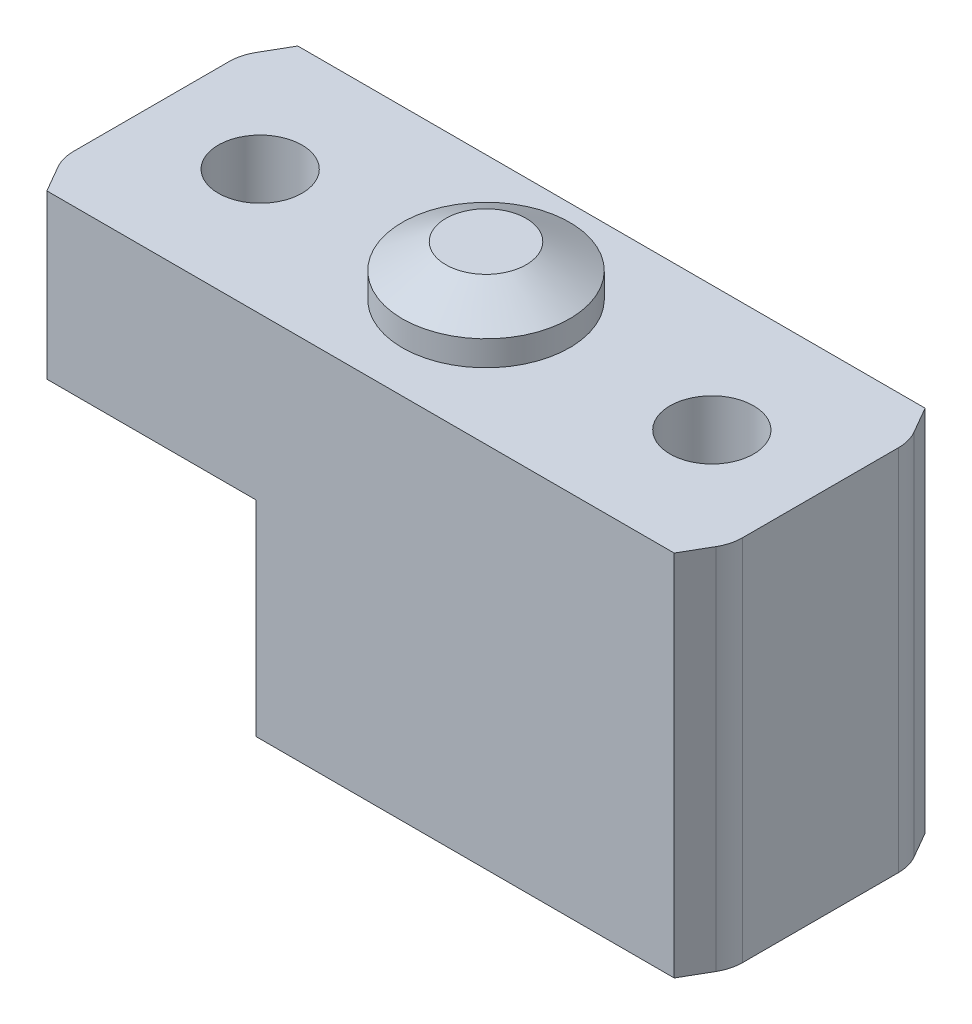
ISO-10303-21;
HEADER;
FILE_DESCRIPTION(('STEP AP214'),'2;1');
FILE_NAME('part.step','',(''),(''),'','','');
FILE_SCHEMA(('AUTOMOTIVE_DESIGN { 1 0 10303 214 1 1 1 1 }'));
ENDSEC;
DATA;
#1=APPLICATION_CONTEXT('core data for automotive mechanical design processes');
#2=APPLICATION_PROTOCOL_DEFINITION('international standard','automotive_design',2000,#1);
#3=PRODUCT_CONTEXT('',#1,'mechanical');
#4=PRODUCT('Part','Part','',(#3));
#5=PRODUCT_RELATED_PRODUCT_CATEGORY('part','',(#4));
#6=PRODUCT_DEFINITION_FORMATION('','',#4);
#7=PRODUCT_DEFINITION_CONTEXT('part definition',#1,'design');
#8=PRODUCT_DEFINITION('design','',#6,#7);
#9=PRODUCT_DEFINITION_SHAPE('','',#8);
#10=(LENGTH_UNIT() NAMED_UNIT(*) SI_UNIT(.MILLI.,.METRE.));
#11=(NAMED_UNIT(*) PLANE_ANGLE_UNIT() SI_UNIT($,.RADIAN.));
#12=(NAMED_UNIT(*) SI_UNIT($,.STERADIAN.) SOLID_ANGLE_UNIT());
#13=UNCERTAINTY_MEASURE_WITH_UNIT(LENGTH_MEASURE(1.E-05),#10,'distance_accuracy_value','');
#14=(GEOMETRIC_REPRESENTATION_CONTEXT(3) GLOBAL_UNCERTAINTY_ASSIGNED_CONTEXT((#13)) GLOBAL_UNIT_ASSIGNED_CONTEXT((#10,
#11,#12)) REPRESENTATION_CONTEXT('',''));
#15=CARTESIAN_POINT('',(0.,0.,0.));
#16=DIRECTION('',(0.,0.,1.));
#17=DIRECTION('',(1.,0.,0.));
#18=AXIS2_PLACEMENT_3D('',#15,#16,#17);
#19=CARTESIAN_POINT('',(0.,0.,0.));
#20=DIRECTION('',(0.,1.,0.));
#21=DIRECTION('',(0.,0.,1.));
#22=AXIS2_PLACEMENT_3D('',#19,#20,#21);
#23=PLANE('',#22);
#24=CARTESIAN_POINT('',(1.3,0.,1.5));
#25=DIRECTION('',(0.,1.,0.));
#26=DIRECTION('',(0.,0.,1.));
#27=AXIS2_PLACEMENT_3D('',#24,#25,#26);
#28=CIRCLE('',#27,0.5);
#29=CARTESIAN_POINT('',(1.3,0.,2.));
#30=VERTEX_POINT('',#29);
#31=EDGE_CURVE('E454',#30,#30,#28,.T.);
#32=ORIENTED_EDGE('',*,*,#31,.T.);
#33=EDGE_LOOP('',(#32));
#34=FACE_BOUND('',#33,.T.);
#35=DIRECTION('',(0.,0.,-1.));
#36=VECTOR('',#35,1.);
#37=CARTESIAN_POINT('',(2.5,0.,3.));
#38=LINE('',#37,#36);
#39=CARTESIAN_POINT('',(2.5,0.,2.43301270189222));
#40=VERTEX_POINT('',#39);
#41=CARTESIAN_POINT('',(2.5,0.,0.566987298107781));
#42=VERTEX_POINT('',#41);
#43=EDGE_CURVE('E437',#40,#42,#38,.T.);
#44=ORIENTED_EDGE('',*,*,#43,.F.);
#45=DIRECTION('',(1.,0.,0.));
#46=VECTOR('',#45,1.);
#47=CARTESIAN_POINT('',(0.,0.,2.43301270189222));
#48=LINE('',#47,#46);
#49=CARTESIAN_POINT('',(0.,0.,2.43301270189222));
#50=VERTEX_POINT('',#49);
#51=EDGE_CURVE('E252',#40,#50,#48,.F.);
#52=ORIENTED_EDGE('',*,*,#51,.T.);
#53=DIRECTION('',(0.,0.,1.));
#54=VECTOR('',#53,1.);
#55=CARTESIAN_POINT('',(0.,0.,0.));
#56=LINE('',#55,#54);
#57=CARTESIAN_POINT('',(0.,0.,0.566987298107781));
#58=VERTEX_POINT('',#57);
#59=EDGE_CURVE('E461',#58,#50,#56,.T.);
#60=ORIENTED_EDGE('',*,*,#59,.F.);
#61=DIRECTION('',(-1.,0.,0.));
#62=VECTOR('',#61,1.);
#63=CARTESIAN_POINT('',(2.5,0.,0.566987298107781));
#64=LINE('',#63,#62);
#65=EDGE_CURVE('E248',#58,#42,#64,.F.);
#66=ORIENTED_EDGE('',*,*,#65,.T.);
#67=EDGE_LOOP('',(#44,#52,#60,#66));
#68=FACE_BOUND('',#67,.T.);
#69=ADVANCED_FACE('F41',(#34,#68),#23,.F.);
#70=CARTESIAN_POINT('',(0.,2.2,0.));
#71=DIRECTION('',(1.,0.,0.));
#72=DIRECTION('',(0.,0.,-1.));
#73=AXIS2_PLACEMENT_3D('',#70,#71,#72);
#74=PLANE('',#73);
#75=ORIENTED_EDGE('',*,*,#59,.T.);
#76=DIRECTION('',(0.,-1.,0.));
#77=VECTOR('',#76,1.);
#78=CARTESIAN_POINT('',(0.,2.2,2.43301270189222));
#79=LINE('',#78,#77);
#80=CARTESIAN_POINT('',(0.,2.2,2.43301270189222));
#81=VERTEX_POINT('',#80);
#82=EDGE_CURVE('E259',#50,#81,#79,.F.);
#83=ORIENTED_EDGE('',*,*,#82,.T.);
#84=DIRECTION('',(0.,0.,1.));
#85=VECTOR('',#84,1.);
#86=CARTESIAN_POINT('',(0.,2.2,0.));
#87=LINE('',#86,#85);
#88=CARTESIAN_POINT('',(0.,2.2,0.566987298107781));
#89=VERTEX_POINT('',#88);
#90=EDGE_CURVE('E456',#89,#81,#87,.T.);
#91=ORIENTED_EDGE('',*,*,#90,.F.);
#92=DIRECTION('',(0.,1.,0.));
#93=VECTOR('',#92,1.);
#94=CARTESIAN_POINT('',(0.,0.,0.566987298107781));
#95=LINE('',#94,#93);
#96=EDGE_CURVE('E253',#89,#58,#95,.F.);
#97=ORIENTED_EDGE('',*,*,#96,.T.);
#98=EDGE_LOOP('',(#75,#83,#91,#97));
#99=FACE_BOUND('',#98,.T.);
#100=ADVANCED_FACE('F312',(#99),#74,.F.);
#101=CARTESIAN_POINT('',(0.,2.2,3.));
#102=DIRECTION('',(0.,0.,-1.));
#103=DIRECTION('',(-1.,0.,0.));
#104=AXIS2_PLACEMENT_3D('',#101,#102,#103);
#105=PLANE('',#104);
#106=DIRECTION('',(1.,0.,0.));
#107=VECTOR('',#106,1.);
#108=CARTESIAN_POINT('',(0.,2.2,3.));
#109=LINE('',#108,#107);
#110=CARTESIAN_POINT('',(0.250000000000002,2.2,3.));
#111=VERTEX_POINT('',#110);
#112=CARTESIAN_POINT('',(7.75,2.2,3.));
#113=VERTEX_POINT('',#112);
#114=EDGE_CURVE('E465',#111,#113,#109,.T.);
#115=ORIENTED_EDGE('',*,*,#114,.F.);
#116=DIRECTION('',(0.,-1.,0.));
#117=VECTOR('',#116,1.);
#118=CARTESIAN_POINT('',(0.250000000000002,2.2,3.));
#119=LINE('',#118,#117);
#120=CARTESIAN_POINT('',(0.250000000000002,0.250000000000002,3.));
#121=VERTEX_POINT('',#120);
#122=EDGE_CURVE('E225',#111,#121,#119,.T.);
#123=ORIENTED_EDGE('',*,*,#122,.T.);
#124=DIRECTION('',(1.,0.,0.));
#125=VECTOR('',#124,1.);
#126=CARTESIAN_POINT('',(0.,0.250000000000002,3.));
#127=LINE('',#126,#125);
#128=CARTESIAN_POINT('',(2.75,0.250000000000002,3.));
#129=VERTEX_POINT('',#128);
#130=EDGE_CURVE('E216',#121,#129,#127,.T.);
#131=ORIENTED_EDGE('',*,*,#130,.T.);
#132=DIRECTION('',(0.,-1.,0.));
#133=VECTOR('',#132,1.);
#134=CARTESIAN_POINT('',(2.75,2.2,3.));
#135=LINE('',#134,#133);
#136=CARTESIAN_POINT('',(2.75,-2.2,3.));
#137=VERTEX_POINT('',#136);
#138=EDGE_CURVE('E217',#129,#137,#135,.T.);
#139=ORIENTED_EDGE('',*,*,#138,.T.);
#140=DIRECTION('',(-1.,0.,0.));
#141=VECTOR('',#140,1.);
#142=CARTESIAN_POINT('',(8.,-2.2,3.));
#143=LINE('',#142,#141);
#144=CARTESIAN_POINT('',(7.75,-2.2,3.));
#145=VERTEX_POINT('',#144);
#146=EDGE_CURVE('E438',#145,#137,#143,.T.);
#147=ORIENTED_EDGE('',*,*,#146,.F.);
#148=DIRECTION('',(0.,1.,0.));
#149=VECTOR('',#148,1.);
#150=CARTESIAN_POINT('',(7.75,2.2,3.));
#151=LINE('',#150,#149);
#152=EDGE_CURVE('E218',#145,#113,#151,.T.);
#153=ORIENTED_EDGE('',*,*,#152,.T.);
#154=EDGE_LOOP('',(#115,#123,#131,#139,#147,#153));
#155=FACE_BOUND('',#154,.T.);
#156=ADVANCED_FACE('F318',(#155),#105,.F.);
#157=CARTESIAN_POINT('',(8.,2.2,0.));
#158=DIRECTION('',(-1.,0.,0.));
#159=DIRECTION('',(0.,0.,1.));
#160=AXIS2_PLACEMENT_3D('',#157,#158,#159);
#161=PLANE('',#160);
#162=DIRECTION('',(0.,0.,-1.));
#163=VECTOR('',#162,1.);
#164=CARTESIAN_POINT('',(8.,2.2,0.));
#165=LINE('',#164,#163);
#166=CARTESIAN_POINT('',(8.,2.2,2.43301270189222));
#167=VERTEX_POINT('',#166);
#168=CARTESIAN_POINT('',(8.,2.2,0.566987298107782));
#169=VERTEX_POINT('',#168);
#170=EDGE_CURVE('E470',#167,#169,#165,.T.);
#171=ORIENTED_EDGE('',*,*,#170,.F.);
#172=DIRECTION('',(0.,1.,0.));
#173=VECTOR('',#172,1.);
#174=CARTESIAN_POINT('',(8.,-2.2,2.43301270189222));
#175=LINE('',#174,#173);
#176=CARTESIAN_POINT('',(8.,-2.2,2.43301270189222));
#177=VERTEX_POINT('',#176);
#178=EDGE_CURVE('E277',#167,#177,#175,.F.);
#179=ORIENTED_EDGE('',*,*,#178,.T.);
#180=DIRECTION('',(0.,0.,1.));
#181=VECTOR('',#180,1.);
#182=CARTESIAN_POINT('',(8.,-2.2,3.));
#183=LINE('',#182,#181);
#184=CARTESIAN_POINT('',(8.,-2.2,0.566987298107782));
#185=VERTEX_POINT('',#184);
#186=EDGE_CURVE('E432',#185,#177,#183,.T.);
#187=ORIENTED_EDGE('',*,*,#186,.F.);
#188=DIRECTION('',(0.,-1.,0.));
#189=VECTOR('',#188,1.);
#190=CARTESIAN_POINT('',(8.,2.2,0.566987298107782));
#191=LINE('',#190,#189);
#192=EDGE_CURVE('E274',#185,#169,#191,.F.);
#193=ORIENTED_EDGE('',*,*,#192,.T.);
#194=EDGE_LOOP('',(#171,#179,#187,#193));
#195=FACE_BOUND('',#194,.T.);
#196=ADVANCED_FACE('F326',(#195),#161,.F.);
#197=CARTESIAN_POINT('',(0.,2.2,0.));
#198=DIRECTION('',(0.,0.,1.));
#199=DIRECTION('',(1.,0.,0.));
#200=AXIS2_PLACEMENT_3D('',#197,#198,#199);
#201=PLANE('',#200);
#202=DIRECTION('',(-1.,0.,0.));
#203=VECTOR('',#202,1.);
#204=CARTESIAN_POINT('',(0.,2.2,0.));
#205=LINE('',#204,#203);
#206=CARTESIAN_POINT('',(7.75,2.2,0.));
#207=VERTEX_POINT('',#206);
#208=CARTESIAN_POINT('',(0.25,2.2,0.));
#209=VERTEX_POINT('',#208);
#210=EDGE_CURVE('E460',#207,#209,#205,.T.);
#211=ORIENTED_EDGE('',*,*,#210,.F.);
#212=DIRECTION('',(0.,-1.,0.));
#213=VECTOR('',#212,1.);
#214=CARTESIAN_POINT('',(7.75,2.2,0.));
#215=LINE('',#214,#213);
#216=CARTESIAN_POINT('',(7.75,-2.2,0.));
#217=VERTEX_POINT('',#216);
#218=EDGE_CURVE('E189',#207,#217,#215,.T.);
#219=ORIENTED_EDGE('',*,*,#218,.T.);
#220=DIRECTION('',(1.,0.,0.));
#221=VECTOR('',#220,1.);
#222=CARTESIAN_POINT('',(8.,-2.2,0.));
#223=LINE('',#222,#221);
#224=CARTESIAN_POINT('',(2.75,-2.2,0.));
#225=VERTEX_POINT('',#224);
#226=EDGE_CURVE('E175',#225,#217,#223,.T.);
#227=ORIENTED_EDGE('',*,*,#226,.F.);
#228=DIRECTION('',(0.,1.,0.));
#229=VECTOR('',#228,1.);
#230=CARTESIAN_POINT('',(2.75,2.2,0.));
#231=LINE('',#230,#229);
#232=CARTESIAN_POINT('',(2.75,0.25,0.));
#233=VERTEX_POINT('',#232);
#234=EDGE_CURVE('E187',#225,#233,#231,.T.);
#235=ORIENTED_EDGE('',*,*,#234,.T.);
#236=DIRECTION('',(-1.,0.,0.));
#237=VECTOR('',#236,1.);
#238=CARTESIAN_POINT('',(0.,0.25,0.));
#239=LINE('',#238,#237);
#240=CARTESIAN_POINT('',(0.25,0.25,0.));
#241=VERTEX_POINT('',#240);
#242=EDGE_CURVE('E195',#233,#241,#239,.T.);
#243=ORIENTED_EDGE('',*,*,#242,.T.);
#244=DIRECTION('',(0.,1.,0.));
#245=VECTOR('',#244,1.);
#246=CARTESIAN_POINT('',(0.25,2.2,0.));
#247=LINE('',#246,#245);
#248=EDGE_CURVE('E200',#241,#209,#247,.T.);
#249=ORIENTED_EDGE('',*,*,#248,.T.);
#250=EDGE_LOOP('',(#211,#219,#227,#235,#243,#249));
#251=FACE_BOUND('',#250,.T.);
#252=ADVANCED_FACE('F183',(#251),#201,.F.);
#253=CARTESIAN_POINT('',(0.,2.2,0.));
#254=DIRECTION('',(0.,1.,0.));
#255=DIRECTION('',(0.,0.,1.));
#256=AXIS2_PLACEMENT_3D('',#253,#254,#255);
#257=PLANE('',#256);
#258=CARTESIAN_POINT('',(1.3,2.2,1.5));
#259=DIRECTION('',(0.,1.,0.));
#260=DIRECTION('',(0.,0.,1.));
#261=AXIS2_PLACEMENT_3D('',#258,#259,#260);
#262=CIRCLE('',#261,0.5);
#263=CARTESIAN_POINT('',(1.3,2.2,2.));
#264=VERTEX_POINT('',#263);
#265=EDGE_CURVE('E448',#264,#264,#262,.T.);
#266=ORIENTED_EDGE('',*,*,#265,.F.);
#267=EDGE_LOOP('',(#266));
#268=FACE_BOUND('',#267,.T.);
#269=CARTESIAN_POINT('',(6.7,2.2,1.5));
#270=DIRECTION('',(0.,1.,0.));
#271=DIRECTION('',(0.,0.,-1.));
#272=AXIS2_PLACEMENT_3D('',#269,#270,#271);
#273=CIRCLE('',#272,0.5);
#274=CARTESIAN_POINT('',(6.7,2.2,1.));
#275=VERTEX_POINT('',#274);
#276=EDGE_CURVE('E186',#275,#275,#273,.T.);
#277=ORIENTED_EDGE('',*,*,#276,.F.);
#278=EDGE_LOOP('',(#277));
#279=FACE_BOUND('',#278,.T.);
#280=CARTESIAN_POINT('',(4.,2.2,1.5));
#281=DIRECTION('',(0.,1.,0.));
#282=DIRECTION('',(0.,0.,1.));
#283=AXIS2_PLACEMENT_3D('',#280,#281,#282);
#284=CIRCLE('',#283,1.);
#285=CARTESIAN_POINT('',(4.,2.2,2.5));
#286=VERTEX_POINT('',#285);
#287=EDGE_CURVE('E458',#286,#286,#284,.T.);
#288=ORIENTED_EDGE('',*,*,#287,.F.);
#289=EDGE_LOOP('',(#288));
#290=FACE_BOUND('',#289,.T.);
#291=ORIENTED_EDGE('',*,*,#90,.T.);
#292=CARTESIAN_POINT('',(0.5,2.2,2.43301270189222));
#293=DIRECTION('',(0.,1.,0.));
#294=DIRECTION('',(0.,0.,1.));
#295=AXIS2_PLACEMENT_3D('',#292,#293,#294);
#296=CIRCLE('',#295,0.5);
#297=CARTESIAN_POINT('',(0.066987298107781,2.2,2.68301270189222));
#298=VERTEX_POINT('',#297);
#299=EDGE_CURVE('E267',#81,#298,#296,.T.);
#300=ORIENTED_EDGE('',*,*,#299,.T.);
#301=DIRECTION('',(-0.5,0.,-0.866025403784439));
#302=VECTOR('',#301,1.);
#303=CARTESIAN_POINT('',(-1.11153810567666,2.2,0.641746824526943));
#304=LINE('',#303,#302);
#305=EDGE_CURVE('E209',#298,#111,#304,.F.);
#306=ORIENTED_EDGE('',*,*,#305,.T.);
#307=ORIENTED_EDGE('',*,*,#114,.T.);
#308=DIRECTION('',(-0.5,0.,0.866025403784439));
#309=VECTOR('',#308,1.);
#310=CARTESIAN_POINT('',(7.11153810567666,2.2,4.1058484396647));
#311=LINE('',#310,#309);
#312=CARTESIAN_POINT('',(7.93301270189222,2.2,2.68301270189222));
#313=VERTEX_POINT('',#312);
#314=EDGE_CURVE('E207',#113,#313,#311,.F.);
#315=ORIENTED_EDGE('',*,*,#314,.T.);
#316=CARTESIAN_POINT('',(7.5,2.2,2.43301270189222));
#317=DIRECTION('',(0.,1.,0.));
#318=DIRECTION('',(0.,0.,1.));
#319=AXIS2_PLACEMENT_3D('',#316,#317,#318);
#320=CIRCLE('',#319,0.5);
#321=EDGE_CURVE('E264',#313,#167,#320,.T.);
#322=ORIENTED_EDGE('',*,*,#321,.T.);
#323=ORIENTED_EDGE('',*,*,#170,.T.);
#324=CARTESIAN_POINT('',(7.5,2.2,0.566987298107782));
#325=DIRECTION('',(0.,1.,0.));
#326=DIRECTION('',(0.,0.,1.));
#327=AXIS2_PLACEMENT_3D('',#324,#325,#326);
#328=CIRCLE('',#327,0.5);
#329=CARTESIAN_POINT('',(7.93301270189222,2.2,0.316987298107784));
#330=VERTEX_POINT('',#329);
#331=EDGE_CURVE('E260',#169,#330,#328,.T.);
#332=ORIENTED_EDGE('',*,*,#331,.T.);
#333=DIRECTION('',(0.5,0.,0.866025403784439));
#334=VECTOR('',#333,1.);
#335=CARTESIAN_POINT('',(5.8125,2.2,-3.3558484396647));
#336=LINE('',#335,#334);
#337=EDGE_CURVE('E213',#330,#207,#336,.F.);
#338=ORIENTED_EDGE('',*,*,#337,.T.);
#339=ORIENTED_EDGE('',*,*,#210,.T.);
#340=DIRECTION('',(0.5,0.,-0.866025403784439));
#341=VECTOR('',#340,1.);
#342=CARTESIAN_POINT('',(0.1875,2.2,0.108253175473055));
#343=LINE('',#342,#341);
#344=CARTESIAN_POINT('',(0.0669872981077807,2.2,0.316987298107781));
#345=VERTEX_POINT('',#344);
#346=EDGE_CURVE('E211',#209,#345,#343,.F.);
#347=ORIENTED_EDGE('',*,*,#346,.T.);
#348=CARTESIAN_POINT('',(0.5,2.2,0.566987298107781));
#349=DIRECTION('',(0.,1.,0.));
#350=DIRECTION('',(0.,0.,1.));
#351=AXIS2_PLACEMENT_3D('',#348,#349,#350);
#352=CIRCLE('',#351,0.5);
#353=EDGE_CURVE('E265',#345,#89,#352,.T.);
#354=ORIENTED_EDGE('',*,*,#353,.T.);
#355=EDGE_LOOP('',(#291,#300,#306,#307,#315,#322,#323,#332,#338,#339,#347,#354));
#356=FACE_BOUND('',#355,.T.);
#357=ADVANCED_FACE('F329',(#268,#279,#290,#356),#257,.T.);
#358=CARTESIAN_POINT('',(4.,2.8,1.5));
#359=DIRECTION('',(0.,-1.,0.));
#360=DIRECTION('',(0.,0.,-1.));
#361=AXIS2_PLACEMENT_3D('',#358,#359,#360);
#362=CYLINDRICAL_SURFACE('',#361,1.);
#363=CARTESIAN_POINT('',(4.,2.5,1.5));
#364=DIRECTION('',(0.,1.,0.));
#365=DIRECTION('',(0.,0.,1.));
#366=AXIS2_PLACEMENT_3D('',#363,#364,#365);
#367=CIRCLE('',#366,1.);
#368=CARTESIAN_POINT('',(4.,2.5,2.5));
#369=VERTEX_POINT('',#368);
#370=EDGE_CURVE('E11',#369,#369,#367,.F.);
#371=ORIENTED_EDGE('',*,*,#370,.T.);
#372=EDGE_LOOP('',(#371));
#373=FACE_BOUND('',#372,.T.);
#374=ORIENTED_EDGE('',*,*,#287,.T.);
#375=EDGE_LOOP('',(#374));
#376=FACE_BOUND('',#375,.T.);
#377=ADVANCED_FACE('F505',(#373,#376),#362,.T.);
#378=CARTESIAN_POINT('',(4.,2.8,1.5));
#379=DIRECTION('',(0.,1.,0.));
#380=DIRECTION('',(0.,0.,1.));
#381=AXIS2_PLACEMENT_3D('',#378,#379,#380);
#382=PLANE('',#381);
#383=CARTESIAN_POINT('',(4.,2.8,1.5));
#384=DIRECTION('',(0.,1.,0.));
#385=DIRECTION('',(0.,0.,1.));
#386=AXIS2_PLACEMENT_3D('',#383,#384,#385);
#387=CIRCLE('',#386,0.480384757729335);
#388=CARTESIAN_POINT('',(4.,2.8,1.98038475772933));
#389=VERTEX_POINT('',#388);
#390=EDGE_CURVE('E49',#389,#389,#387,.T.);
#391=ORIENTED_EDGE('',*,*,#390,.T.);
#392=EDGE_LOOP('',(#391));
#393=FACE_BOUND('',#392,.T.);
#394=ADVANCED_FACE('F301',(#393),#382,.T.);
#395=CARTESIAN_POINT('',(6.7,-0.3,1.5));
#396=DIRECTION('',(0.,1.,0.));
#397=DIRECTION('',(0.,0.,1.));
#398=AXIS2_PLACEMENT_3D('',#395,#396,#397);
#399=CYLINDRICAL_SURFACE('',#398,0.5);
#400=CARTESIAN_POINT('',(6.7,-2.2,1.5));
#401=DIRECTION('',(0.,-1.,0.));
#402=DIRECTION('',(0.,0.,-1.));
#403=AXIS2_PLACEMENT_3D('',#400,#401,#402);
#404=CIRCLE('',#403,0.5);
#405=CARTESIAN_POINT('',(6.7,-2.2,1.));
#406=VERTEX_POINT('',#405);
#407=EDGE_CURVE('E233',#406,#406,#404,.T.);
#408=ORIENTED_EDGE('',*,*,#407,.T.);
#409=EDGE_LOOP('',(#408));
#410=FACE_BOUND('',#409,.T.);
#411=ORIENTED_EDGE('',*,*,#276,.T.);
#412=EDGE_LOOP('',(#411));
#413=FACE_BOUND('',#412,.T.);
#414=ADVANCED_FACE('F493',(#410,#413),#399,.F.);
#415=CARTESIAN_POINT('',(1.3,-0.3,1.5));
#416=DIRECTION('',(0.,1.,0.));
#417=DIRECTION('',(0.,0.,1.));
#418=AXIS2_PLACEMENT_3D('',#415,#416,#417);
#419=CYLINDRICAL_SURFACE('',#418,0.5);
#420=ORIENTED_EDGE('',*,*,#265,.T.);
#421=EDGE_LOOP('',(#420));
#422=FACE_BOUND('',#421,.T.);
#423=ORIENTED_EDGE('',*,*,#31,.F.);
#424=EDGE_LOOP('',(#423));
#425=FACE_BOUND('',#424,.T.);
#426=ADVANCED_FACE('F482',(#422,#425),#419,.F.);
#427=CARTESIAN_POINT('',(0.,-2.2,0.));
#428=DIRECTION('',(0.,1.,0.));
#429=DIRECTION('',(0.,0.,1.));
#430=AXIS2_PLACEMENT_3D('',#427,#428,#429);
#431=PLANE('',#430);
#432=ORIENTED_EDGE('',*,*,#407,.F.);
#433=EDGE_LOOP('',(#432));
#434=FACE_BOUND('',#433,.T.);
#435=CARTESIAN_POINT('',(4.,-2.2,1.5));
#436=DIRECTION('',(0.,-1.,0.));
#437=DIRECTION('',(0.,0.,-1.));
#438=AXIS2_PLACEMENT_3D('',#435,#436,#437);
#439=CIRCLE('',#438,1.);
#440=CARTESIAN_POINT('',(4.,-2.2,0.5));
#441=VERTEX_POINT('',#440);
#442=EDGE_CURVE('E447',#441,#441,#439,.T.);
#443=ORIENTED_EDGE('',*,*,#442,.F.);
#444=EDGE_LOOP('',(#443));
#445=FACE_BOUND('',#444,.T.);
#446=DIRECTION('',(0.5,0.,0.866025403784439));
#447=VECTOR('',#446,1.);
#448=CARTESIAN_POINT('',(2.5,-2.2,2.56698729810778));
#449=LINE('',#448,#447);
#450=CARTESIAN_POINT('',(2.56698729810778,-2.2,2.68301270189222));
#451=VERTEX_POINT('',#450);
#452=EDGE_CURVE('E178',#137,#451,#449,.F.);
#453=ORIENTED_EDGE('',*,*,#452,.T.);
#454=CARTESIAN_POINT('',(3.,-2.2,2.43301270189222));
#455=DIRECTION('',(0.,1.,0.));
#456=DIRECTION('',(0.,0.,1.));
#457=AXIS2_PLACEMENT_3D('',#454,#455,#456);
#458=CIRCLE('',#457,0.5);
#459=CARTESIAN_POINT('',(2.5,-2.2,2.43301270189222));
#460=VERTEX_POINT('',#459);
#461=EDGE_CURVE('E250',#451,#460,#458,.F.);
#462=ORIENTED_EDGE('',*,*,#461,.T.);
#463=DIRECTION('',(0.,0.,-1.));
#464=VECTOR('',#463,1.);
#465=CARTESIAN_POINT('',(2.5,-2.2,3.));
#466=LINE('',#465,#464);
#467=CARTESIAN_POINT('',(2.5,-2.2,0.566987298107781));
#468=VERTEX_POINT('',#467);
#469=EDGE_CURVE('E188',#460,#468,#466,.T.);
#470=ORIENTED_EDGE('',*,*,#469,.T.);
#471=CARTESIAN_POINT('',(3.,-2.2,0.566987298107781));
#472=DIRECTION('',(0.,1.,0.));
#473=DIRECTION('',(0.,0.,1.));
#474=AXIS2_PLACEMENT_3D('',#471,#472,#473);
#475=CIRCLE('',#474,0.5);
#476=CARTESIAN_POINT('',(2.56698729810778,-2.2,0.316987298107781));
#477=VERTEX_POINT('',#476);
#478=EDGE_CURVE('E174',#468,#477,#475,.F.);
#479=ORIENTED_EDGE('',*,*,#478,.T.);
#480=DIRECTION('',(-0.5,0.,0.866025403784439));
#481=VECTOR('',#480,1.);
#482=CARTESIAN_POINT('',(2.75,-2.2,0.));
#483=LINE('',#482,#481);
#484=EDGE_CURVE('E170',#477,#225,#483,.F.);
#485=ORIENTED_EDGE('',*,*,#484,.T.);
#486=ORIENTED_EDGE('',*,*,#226,.T.);
#487=DIRECTION('',(-0.5,0.,-0.866025403784439));
#488=VECTOR('',#487,1.);
#489=CARTESIAN_POINT('',(7.75,-2.2,0.));
#490=LINE('',#489,#488);
#491=CARTESIAN_POINT('',(7.93301270189222,-2.2,0.316987298107783));
#492=VERTEX_POINT('',#491);
#493=EDGE_CURVE('E180',#217,#492,#490,.F.);
#494=ORIENTED_EDGE('',*,*,#493,.T.);
#495=CARTESIAN_POINT('',(7.5,-2.2,0.566987298107782));
#496=DIRECTION('',(0.,1.,0.));
#497=DIRECTION('',(0.,0.,1.));
#498=AXIS2_PLACEMENT_3D('',#495,#496,#497);
#499=CIRCLE('',#498,0.5);
#500=EDGE_CURVE('E245',#492,#185,#499,.F.);
#501=ORIENTED_EDGE('',*,*,#500,.T.);
#502=ORIENTED_EDGE('',*,*,#186,.T.);
#503=CARTESIAN_POINT('',(7.5,-2.2,2.43301270189222));
#504=DIRECTION('',(0.,1.,0.));
#505=DIRECTION('',(0.,0.,1.));
#506=AXIS2_PLACEMENT_3D('',#503,#504,#505);
#507=CIRCLE('',#506,0.5);
#508=CARTESIAN_POINT('',(7.93301270189222,-2.2,2.68301270189222));
#509=VERTEX_POINT('',#508);
#510=EDGE_CURVE('E242',#177,#509,#507,.F.);
#511=ORIENTED_EDGE('',*,*,#510,.T.);
#512=DIRECTION('',(0.5,0.,-0.866025403784439));
#513=VECTOR('',#512,1.);
#514=CARTESIAN_POINT('',(8.,-2.2,2.56698729810778));
#515=LINE('',#514,#513);
#516=EDGE_CURVE('E199',#509,#145,#515,.F.);
#517=ORIENTED_EDGE('',*,*,#516,.T.);
#518=ORIENTED_EDGE('',*,*,#146,.T.);
#519=EDGE_LOOP('',(#453,#462,#470,#479,#485,#486,#494,#501,#502,#511,#517,#518));
#520=FACE_BOUND('',#519,.T.);
#521=ADVANCED_FACE('F167',(#434,#445,#520),#431,.F.);
#522=CARTESIAN_POINT('',(2.5,-2.2,3.));
#523=DIRECTION('',(1.,0.,0.));
#524=DIRECTION('',(0.,0.,-1.));
#525=AXIS2_PLACEMENT_3D('',#522,#523,#524);
#526=PLANE('',#525);
#527=ORIENTED_EDGE('',*,*,#469,.F.);
#528=DIRECTION('',(0.,-1.,0.));
#529=VECTOR('',#528,1.);
#530=CARTESIAN_POINT('',(2.5,0.,2.43301270189222));
#531=LINE('',#530,#529);
#532=EDGE_CURVE('E240',#460,#40,#531,.F.);
#533=ORIENTED_EDGE('',*,*,#532,.T.);
#534=ORIENTED_EDGE('',*,*,#43,.T.);
#535=DIRECTION('',(0.,1.,0.));
#536=VECTOR('',#535,1.);
#537=CARTESIAN_POINT('',(2.5,-2.2,0.566987298107781));
#538=LINE('',#537,#536);
#539=EDGE_CURVE('E228',#42,#468,#538,.F.);
#540=ORIENTED_EDGE('',*,*,#539,.T.);
#541=EDGE_LOOP('',(#527,#533,#534,#540));
#542=FACE_BOUND('',#541,.T.);
#543=ADVANCED_FACE('F476',(#542),#526,.F.);
#544=CARTESIAN_POINT('',(4.,-2.8,1.5));
#545=DIRECTION('',(0.,1.,0.));
#546=DIRECTION('',(0.,0.,1.));
#547=AXIS2_PLACEMENT_3D('',#544,#545,#546);
#548=CYLINDRICAL_SURFACE('',#547,1.);
#549=CARTESIAN_POINT('',(4.,-2.5,1.5));
#550=DIRECTION('',(0.,-1.,0.));
#551=DIRECTION('',(0.,0.,-1.));
#552=AXIS2_PLACEMENT_3D('',#549,#550,#551);
#553=CIRCLE('',#552,1.);
#554=CARTESIAN_POINT('',(4.,-2.5,0.5));
#555=VERTEX_POINT('',#554);
#556=EDGE_CURVE('E298',#555,#555,#553,.F.);
#557=ORIENTED_EDGE('',*,*,#556,.T.);
#558=EDGE_LOOP('',(#557));
#559=FACE_BOUND('',#558,.T.);
#560=ORIENTED_EDGE('',*,*,#442,.T.);
#561=EDGE_LOOP('',(#560));
#562=FACE_BOUND('',#561,.T.);
#563=ADVANCED_FACE('F479',(#559,#562),#548,.T.);
#564=CARTESIAN_POINT('',(4.,-2.8,1.5));
#565=DIRECTION('',(0.,-1.,0.));
#566=DIRECTION('',(0.,0.,-1.));
#567=AXIS2_PLACEMENT_3D('',#564,#565,#566);
#568=PLANE('',#567);
#569=CARTESIAN_POINT('',(4.,-2.8,1.5));
#570=DIRECTION('',(0.,-1.,0.));
#571=DIRECTION('',(0.,0.,-1.));
#572=AXIS2_PLACEMENT_3D('',#569,#570,#571);
#573=CIRCLE('',#572,0.480384757729339);
#574=CARTESIAN_POINT('',(4.,-2.8,1.01961524227066));
#575=VERTEX_POINT('',#574);
#576=EDGE_CURVE('E285',#575,#575,#573,.T.);
#577=ORIENTED_EDGE('',*,*,#576,.T.);
#578=EDGE_LOOP('',(#577));
#579=FACE_BOUND('',#578,.T.);
#580=ADVANCED_FACE('F345',(#579),#568,.T.);
#581=CARTESIAN_POINT('',(7.75,2.2,0.));
#582=DIRECTION('',(-0.866025403784439,0.,0.5));
#583=DIRECTION('',(0.,-1.,0.));
#584=AXIS2_PLACEMENT_3D('',#581,#582,#583);
#585=PLANE('',#584);
#586=ORIENTED_EDGE('',*,*,#337,.F.);
#587=DIRECTION('',(0.,1.,0.));
#588=VECTOR('',#587,1.);
#589=CARTESIAN_POINT('',(7.93301270189222,-2.2,0.316987298107782));
#590=LINE('',#589,#588);
#591=EDGE_CURVE('E284',#330,#492,#590,.F.);
#592=ORIENTED_EDGE('',*,*,#591,.T.);
#593=ORIENTED_EDGE('',*,*,#493,.F.);
#594=ORIENTED_EDGE('',*,*,#218,.F.);
#595=EDGE_LOOP('',(#586,#592,#593,#594));
#596=FACE_BOUND('',#595,.T.);
#597=ADVANCED_FACE('F336',(#596),#585,.F.);
#598=CARTESIAN_POINT('',(0.,2.2,0.43301270189222));
#599=DIRECTION('',(0.866025403784439,0.,0.5));
#600=DIRECTION('',(0.,-1.,0.));
#601=AXIS2_PLACEMENT_3D('',#598,#599,#600);
#602=PLANE('',#601);
#603=DIRECTION('',(-0.447213595499958,-0.447213595499958,0.774596669241483));
#604=VECTOR('',#603,1.);
#605=CARTESIAN_POINT('',(0.44,0.44,-0.329089653438087));
#606=LINE('',#605,#604);
#607=CARTESIAN_POINT('',(0.0669872981077808,0.0669872981077807,0.316987298107781));
#608=VERTEX_POINT('',#607);
#609=EDGE_CURVE('E226',#608,#241,#606,.F.);
#610=ORIENTED_EDGE('',*,*,#609,.F.);
#611=DIRECTION('',(0.,-1.,0.));
#612=VECTOR('',#611,1.);
#613=CARTESIAN_POINT('',(0.0669872981077808,2.2,0.316987298107781));
#614=LINE('',#613,#612);
#615=EDGE_CURVE('E268',#608,#345,#614,.F.);
#616=ORIENTED_EDGE('',*,*,#615,.T.);
#617=ORIENTED_EDGE('',*,*,#346,.F.);
#618=ORIENTED_EDGE('',*,*,#248,.F.);
#619=EDGE_LOOP('',(#610,#616,#617,#618));
#620=FACE_BOUND('',#619,.T.);
#621=ADVANCED_FACE('F343',(#620),#602,.F.);
#622=CARTESIAN_POINT('',(0.,0.25,0.));
#623=DIRECTION('',(0.,0.866025403784439,0.5));
#624=DIRECTION('',(-1.,0.,0.));
#625=AXIS2_PLACEMENT_3D('',#622,#623,#624);
#626=PLANE('',#625);
#627=DIRECTION('',(-0.447213595499958,-0.447213595499958,0.774596669241483));
#628=VECTOR('',#627,1.);
#629=CARTESIAN_POINT('',(3.14,0.640000000000001,-0.675499814951862));
#630=LINE('',#629,#628);
#631=CARTESIAN_POINT('',(2.56698729810778,0.066987298107781,0.316987298107781));
#632=VERTEX_POINT('',#631);
#633=EDGE_CURVE('E194',#632,#233,#630,.F.);
#634=ORIENTED_EDGE('',*,*,#633,.F.);
#635=DIRECTION('',(1.,0.,0.));
#636=VECTOR('',#635,1.);
#637=CARTESIAN_POINT('',(0.,0.0669872981077808,0.316987298107781));
#638=LINE('',#637,#636);
#639=EDGE_CURVE('E63',#632,#608,#638,.F.);
#640=ORIENTED_EDGE('',*,*,#639,.T.);
#641=ORIENTED_EDGE('',*,*,#609,.T.);
#642=ORIENTED_EDGE('',*,*,#242,.F.);
#643=EDGE_LOOP('',(#634,#640,#641,#642));
#644=FACE_BOUND('',#643,.T.);
#645=ADVANCED_FACE('F353',(#644),#626,.F.);
#646=CARTESIAN_POINT('',(2.75,2.2,0.));
#647=DIRECTION('',(0.866025403784439,0.,0.5));
#648=DIRECTION('',(0.,1.,0.));
#649=AXIS2_PLACEMENT_3D('',#646,#647,#648);
#650=PLANE('',#649);
#651=ORIENTED_EDGE('',*,*,#484,.F.);
#652=DIRECTION('',(0.,-1.,0.));
#653=VECTOR('',#652,1.);
#654=CARTESIAN_POINT('',(2.56698729810778,0.,0.316987298107781));
#655=LINE('',#654,#653);
#656=EDGE_CURVE('E60',#477,#632,#655,.F.);
#657=ORIENTED_EDGE('',*,*,#656,.T.);
#658=ORIENTED_EDGE('',*,*,#633,.T.);
#659=ORIENTED_EDGE('',*,*,#234,.F.);
#660=EDGE_LOOP('',(#651,#657,#658,#659));
#661=FACE_BOUND('',#660,.T.);
#662=ADVANCED_FACE('F192',(#661),#650,.F.);
#663=CARTESIAN_POINT('',(2.5,-2.2,2.56698729810778));
#664=DIRECTION('',(0.866025403784439,0.,-0.5));
#665=DIRECTION('',(0.,1.,0.));
#666=AXIS2_PLACEMENT_3D('',#663,#664,#665);
#667=PLANE('',#666);
#668=DIRECTION('',(-0.447213595499958,-0.447213595499958,-0.774596669241484));
#669=VECTOR('',#668,1.);
#670=CARTESIAN_POINT('',(2.2,-0.299999999999998,2.04737205583712));
#671=LINE('',#670,#669);
#672=CARTESIAN_POINT('',(2.56698729810778,0.0669872981077805,2.68301270189222));
#673=VERTEX_POINT('',#672);
#674=EDGE_CURVE('E230',#673,#129,#671,.F.);
#675=ORIENTED_EDGE('',*,*,#674,.F.);
#676=DIRECTION('',(0.,1.,0.));
#677=VECTOR('',#676,1.);
#678=CARTESIAN_POINT('',(2.56698729810778,-2.2,2.68301270189222));
#679=LINE('',#678,#677);
#680=EDGE_CURVE('E239',#673,#451,#679,.F.);
#681=ORIENTED_EDGE('',*,*,#680,.T.);
#682=ORIENTED_EDGE('',*,*,#452,.F.);
#683=ORIENTED_EDGE('',*,*,#138,.F.);
#684=EDGE_LOOP('',(#675,#681,#682,#683));
#685=FACE_BOUND('',#684,.T.);
#686=ADVANCED_FACE('F351',(#685),#667,.F.);
#687=CARTESIAN_POINT('',(0.,0.250000000000002,3.));
#688=DIRECTION('',(0.,0.866025403784439,-0.5));
#689=DIRECTION('',(1.,0.,0.));
#690=AXIS2_PLACEMENT_3D('',#687,#688,#689);
#691=PLANE('',#690);
#692=DIRECTION('',(-0.447213595499958,-0.447213595499958,-0.774596669241484));
#693=VECTOR('',#692,1.);
#694=CARTESIAN_POINT('',(0.200000000000002,0.200000000000002,2.91339745962156));
#695=LINE('',#694,#693);
#696=CARTESIAN_POINT('',(0.066987298107781,0.0669872981077806,2.68301270189222));
#697=VERTEX_POINT('',#696);
#698=EDGE_CURVE('E235',#697,#121,#695,.F.);
#699=ORIENTED_EDGE('',*,*,#698,.F.);
#700=DIRECTION('',(-1.,0.,0.));
#701=VECTOR('',#700,1.);
#702=CARTESIAN_POINT('',(2.5,0.0669872981077806,2.68301270189222));
#703=LINE('',#702,#701);
#704=EDGE_CURVE('E254',#697,#673,#703,.F.);
#705=ORIENTED_EDGE('',*,*,#704,.T.);
#706=ORIENTED_EDGE('',*,*,#674,.T.);
#707=ORIENTED_EDGE('',*,*,#130,.F.);
#708=EDGE_LOOP('',(#699,#705,#706,#707));
#709=FACE_BOUND('',#708,.T.);
#710=ADVANCED_FACE('F372',(#709),#691,.F.);
#711=CARTESIAN_POINT('',(0.250000000000002,2.2,3.));
#712=DIRECTION('',(0.866025403784439,0.,-0.5));
#713=DIRECTION('',(0.,-1.,0.));
#714=AXIS2_PLACEMENT_3D('',#711,#712,#713);
#715=PLANE('',#714);
#716=ORIENTED_EDGE('',*,*,#305,.F.);
#717=DIRECTION('',(0.,1.,0.));
#718=VECTOR('',#717,1.);
#719=CARTESIAN_POINT('',(0.066987298107781,0.,2.68301270189222));
#720=LINE('',#719,#718);
#721=EDGE_CURVE('E270',#298,#697,#720,.F.);
#722=ORIENTED_EDGE('',*,*,#721,.T.);
#723=ORIENTED_EDGE('',*,*,#698,.T.);
#724=ORIENTED_EDGE('',*,*,#122,.F.);
#725=EDGE_LOOP('',(#716,#722,#723,#724));
#726=FACE_BOUND('',#725,.T.);
#727=ADVANCED_FACE('F366',(#726),#715,.F.);
#728=CARTESIAN_POINT('',(8.,2.2,2.56698729810778));
#729=DIRECTION('',(-0.866025403784439,0.,-0.5));
#730=DIRECTION('',(0.,-1.,0.));
#731=AXIS2_PLACEMENT_3D('',#728,#729,#730);
#732=PLANE('',#731);
#733=ORIENTED_EDGE('',*,*,#516,.F.);
#734=DIRECTION('',(0.,-1.,0.));
#735=VECTOR('',#734,1.);
#736=CARTESIAN_POINT('',(7.93301270189222,2.2,2.68301270189222));
#737=LINE('',#736,#735);
#738=EDGE_CURVE('E280',#509,#313,#737,.F.);
#739=ORIENTED_EDGE('',*,*,#738,.T.);
#740=ORIENTED_EDGE('',*,*,#314,.F.);
#741=ORIENTED_EDGE('',*,*,#152,.F.);
#742=EDGE_LOOP('',(#733,#739,#740,#741));
#743=FACE_BOUND('',#742,.T.);
#744=ADVANCED_FACE('F373',(#743),#732,.F.);
#745=CARTESIAN_POINT('',(0.5,2.2,2.43301270189222));
#746=DIRECTION('',(0.,1.,0.));
#747=DIRECTION('',(0.,0.,1.));
#748=AXIS2_PLACEMENT_3D('',#745,#746,#747);
#749=CYLINDRICAL_SURFACE('',#748,0.5);
#750=ORIENTED_EDGE('',*,*,#299,.F.);
#751=ORIENTED_EDGE('',*,*,#82,.F.);
#752=CARTESIAN_POINT('',(0.5,0.5,2.43301270189222));
#753=DIRECTION('',(-0.707106781186547,0.707106781186547,0.));
#754=DIRECTION('',(0.707106781186547,0.707106781186547,0.));
#755=AXIS2_PLACEMENT_3D('',#752,#753,#754);
#756=ELLIPSE('',#755,0.707106781186547,0.5);
#757=EDGE_CURVE('E234',#697,#50,#756,.F.);
#758=ORIENTED_EDGE('',*,*,#757,.F.);
#759=ORIENTED_EDGE('',*,*,#721,.F.);
#760=EDGE_LOOP('',(#750,#751,#758,#759));
#761=FACE_BOUND('',#760,.T.);
#762=ADVANCED_FACE('F393',(#761),#749,.T.);
#763=CARTESIAN_POINT('',(0.,0.5,2.43301270189222));
#764=DIRECTION('',(-1.,0.,0.));
#765=DIRECTION('',(0.,0.,1.));
#766=AXIS2_PLACEMENT_3D('',#763,#764,#765);
#767=CYLINDRICAL_SURFACE('',#766,0.5);
#768=ORIENTED_EDGE('',*,*,#757,.T.);
#769=ORIENTED_EDGE('',*,*,#51,.F.);
#770=CARTESIAN_POINT('',(3.,0.5,2.43301270189222));
#771=DIRECTION('',(-0.707106781186547,0.707106781186547,0.));
#772=DIRECTION('',(0.707106781186547,0.707106781186547,0.));
#773=AXIS2_PLACEMENT_3D('',#770,#771,#772);
#774=ELLIPSE('',#773,0.707106781186547,0.5);
#775=EDGE_CURVE('E281',#673,#40,#774,.F.);
#776=ORIENTED_EDGE('',*,*,#775,.F.);
#777=ORIENTED_EDGE('',*,*,#704,.F.);
#778=EDGE_LOOP('',(#768,#769,#776,#777));
#779=FACE_BOUND('',#778,.T.);
#780=ADVANCED_FACE('F399',(#779),#767,.T.);
#781=CARTESIAN_POINT('',(3.,-2.2,2.43301270189222));
#782=DIRECTION('',(0.,1.,0.));
#783=DIRECTION('',(0.,0.,1.));
#784=AXIS2_PLACEMENT_3D('',#781,#782,#783);
#785=CYLINDRICAL_SURFACE('',#784,0.5);
#786=ORIENTED_EDGE('',*,*,#461,.F.);
#787=ORIENTED_EDGE('',*,*,#680,.F.);
#788=ORIENTED_EDGE('',*,*,#775,.T.);
#789=ORIENTED_EDGE('',*,*,#532,.F.);
#790=EDGE_LOOP('',(#786,#787,#788,#789));
#791=FACE_BOUND('',#790,.T.);
#792=ADVANCED_FACE('F392',(#791),#785,.T.);
#793=CARTESIAN_POINT('',(3.,-2.2,0.566987298107781));
#794=DIRECTION('',(0.,-1.,0.));
#795=DIRECTION('',(0.,0.,-1.));
#796=AXIS2_PLACEMENT_3D('',#793,#794,#795);
#797=CYLINDRICAL_SURFACE('',#796,0.5);
#798=ORIENTED_EDGE('',*,*,#478,.F.);
#799=ORIENTED_EDGE('',*,*,#539,.F.);
#800=CARTESIAN_POINT('',(3.,0.5,0.566987298107781));
#801=DIRECTION('',(0.707106781186547,-0.707106781186547,0.));
#802=DIRECTION('',(0.707106781186547,0.707106781186547,0.));
#803=AXIS2_PLACEMENT_3D('',#800,#801,#802);
#804=ELLIPSE('',#803,0.707106781186547,0.5);
#805=EDGE_CURVE('E289',#632,#42,#804,.F.);
#806=ORIENTED_EDGE('',*,*,#805,.F.);
#807=ORIENTED_EDGE('',*,*,#656,.F.);
#808=EDGE_LOOP('',(#798,#799,#806,#807));
#809=FACE_BOUND('',#808,.T.);
#810=ADVANCED_FACE('F397',(#809),#797,.T.);
#811=CARTESIAN_POINT('',(0.,0.5,0.566987298107781));
#812=DIRECTION('',(1.,0.,0.));
#813=DIRECTION('',(0.,0.,-1.));
#814=AXIS2_PLACEMENT_3D('',#811,#812,#813);
#815=CYLINDRICAL_SURFACE('',#814,0.5);
#816=ORIENTED_EDGE('',*,*,#805,.T.);
#817=ORIENTED_EDGE('',*,*,#65,.F.);
#818=CARTESIAN_POINT('',(0.5,0.5,0.566987298107781));
#819=DIRECTION('',(0.707106781186547,-0.707106781186547,0.));
#820=DIRECTION('',(0.707106781186547,0.707106781186547,0.));
#821=AXIS2_PLACEMENT_3D('',#818,#819,#820);
#822=ELLIPSE('',#821,0.707106781186547,0.5);
#823=EDGE_CURVE('E288',#608,#58,#822,.F.);
#824=ORIENTED_EDGE('',*,*,#823,.F.);
#825=ORIENTED_EDGE('',*,*,#639,.F.);
#826=EDGE_LOOP('',(#816,#817,#824,#825));
#827=FACE_BOUND('',#826,.T.);
#828=ADVANCED_FACE('F408',(#827),#815,.T.);
#829=CARTESIAN_POINT('',(0.5,2.2,0.566987298107781));
#830=DIRECTION('',(0.,-1.,0.));
#831=DIRECTION('',(0.,0.,-1.));
#832=AXIS2_PLACEMENT_3D('',#829,#830,#831);
#833=CYLINDRICAL_SURFACE('',#832,0.5);
#834=ORIENTED_EDGE('',*,*,#353,.F.);
#835=ORIENTED_EDGE('',*,*,#615,.F.);
#836=ORIENTED_EDGE('',*,*,#823,.T.);
#837=ORIENTED_EDGE('',*,*,#96,.F.);
#838=EDGE_LOOP('',(#834,#835,#836,#837));
#839=FACE_BOUND('',#838,.T.);
#840=ADVANCED_FACE('F403',(#839),#833,.T.);
#841=CARTESIAN_POINT('',(7.5,2.2,2.43301270189222));
#842=DIRECTION('',(0.,-1.,0.));
#843=DIRECTION('',(0.,0.,-1.));
#844=AXIS2_PLACEMENT_3D('',#841,#842,#843);
#845=CYLINDRICAL_SURFACE('',#844,0.5);
#846=ORIENTED_EDGE('',*,*,#321,.F.);
#847=ORIENTED_EDGE('',*,*,#738,.F.);
#848=ORIENTED_EDGE('',*,*,#510,.F.);
#849=ORIENTED_EDGE('',*,*,#178,.F.);
#850=EDGE_LOOP('',(#846,#847,#848,#849));
#851=FACE_BOUND('',#850,.T.);
#852=ADVANCED_FACE('F409',(#851),#845,.T.);
#853=CARTESIAN_POINT('',(7.5,2.2,0.566987298107782));
#854=DIRECTION('',(0.,1.,0.));
#855=DIRECTION('',(0.,0.,1.));
#856=AXIS2_PLACEMENT_3D('',#853,#854,#855);
#857=CYLINDRICAL_SURFACE('',#856,0.5);
#858=ORIENTED_EDGE('',*,*,#500,.F.);
#859=ORIENTED_EDGE('',*,*,#591,.F.);
#860=ORIENTED_EDGE('',*,*,#331,.F.);
#861=ORIENTED_EDGE('',*,*,#192,.F.);
#862=EDGE_LOOP('',(#858,#859,#860,#861));
#863=FACE_BOUND('',#862,.T.);
#864=ADVANCED_FACE('F307',(#863),#857,.T.);
#865=CARTESIAN_POINT('',(4.,-2.8,1.5));
#866=DIRECTION('',(0.,1.,0.));
#867=DIRECTION('',(0.,0.,1.));
#868=AXIS2_PLACEMENT_3D('',#865,#866,#867);
#869=CONICAL_SURFACE('',#868,0.480384757729339,1.0471975511966);
#870=ORIENTED_EDGE('',*,*,#556,.F.);
#871=EDGE_LOOP('',(#870));
#872=FACE_BOUND('',#871,.T.);
#873=ORIENTED_EDGE('',*,*,#576,.F.);
#874=EDGE_LOOP('',(#873));
#875=FACE_BOUND('',#874,.T.);
#876=ADVANCED_FACE('F302',(#872,#875),#869,.T.);
#877=CARTESIAN_POINT('',(4.,2.8,1.5));
#878=DIRECTION('',(0.,-1.,0.));
#879=DIRECTION('',(0.,0.,-1.));
#880=AXIS2_PLACEMENT_3D('',#877,#878,#879);
#881=CONICAL_SURFACE('',#880,0.480384757729335,1.0471975511966);
#882=ORIENTED_EDGE('',*,*,#370,.F.);
#883=EDGE_LOOP('',(#882));
#884=FACE_BOUND('',#883,.T.);
#885=ORIENTED_EDGE('',*,*,#390,.F.);
#886=EDGE_LOOP('',(#885));
#887=FACE_BOUND('',#886,.T.);
#888=ADVANCED_FACE('F42',(#884,#887),#881,.T.);
#889=CLOSED_SHELL('',(#69,#100,#156,#196,#252,#357,#377,#394,#414,#426,#521,#543,#563,#580,#597,
#621,#645,#662,#686,#710,#727,#744,#762,#780,#792,#810,#828,#840,#852,#864,#876,#888));
#890=MANIFOLD_SOLID_BREP('B2',#889);
#891=ADVANCED_BREP_SHAPE_REPRESENTATION('',(#18,#890),#14);
#892=SHAPE_DEFINITION_REPRESENTATION(#9,#891);
ENDSEC;
END-ISO-10303-21;
